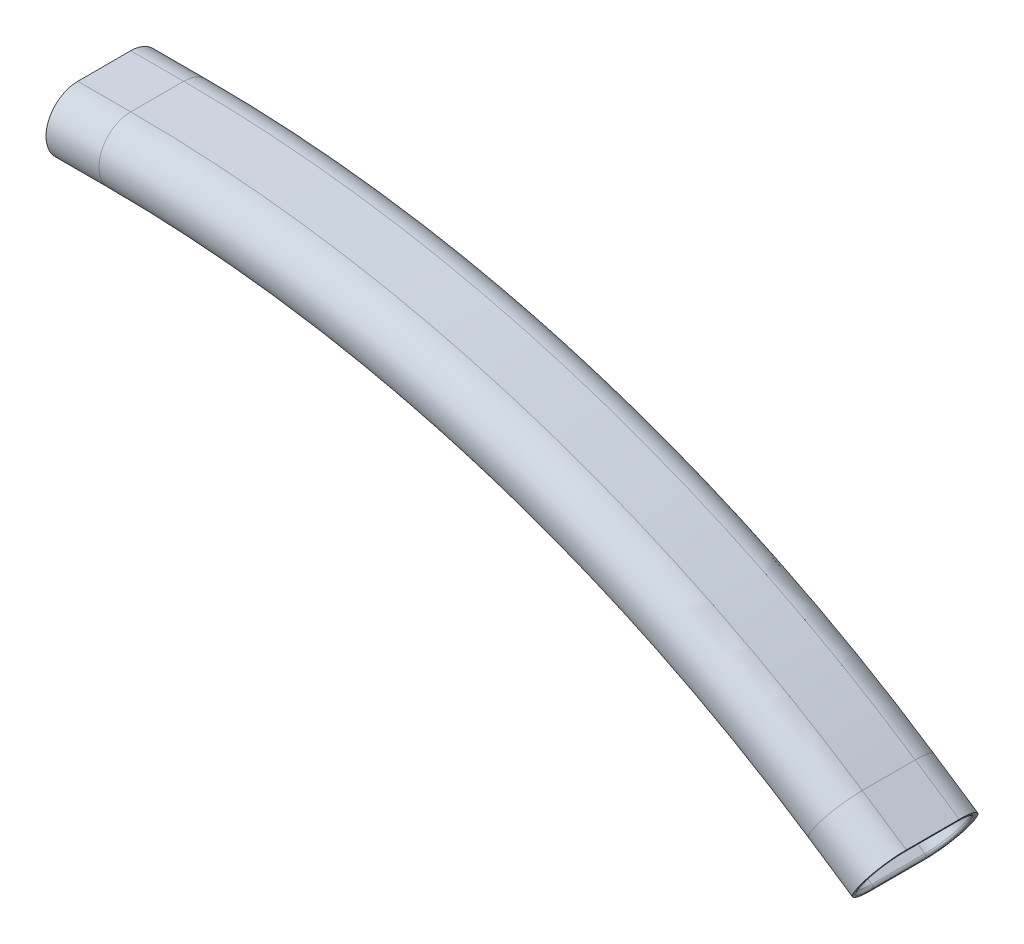
ISO-10303-21;
HEADER;
FILE_DESCRIPTION(('STEP AP214'),'2;1');
FILE_NAME('part.step','',(''),(''),'','','');
FILE_SCHEMA(('AUTOMOTIVE_DESIGN { 1 0 10303 214 1 1 1 1 }'));
ENDSEC;
DATA;
#1=APPLICATION_CONTEXT('core data for automotive mechanical design processes');
#2=APPLICATION_PROTOCOL_DEFINITION('international standard','automotive_design',2000,#1);
#3=PRODUCT_CONTEXT('',#1,'mechanical');
#4=PRODUCT('Part','Part','',(#3));
#5=PRODUCT_RELATED_PRODUCT_CATEGORY('part','',(#4));
#6=PRODUCT_DEFINITION_FORMATION('','',#4);
#7=PRODUCT_DEFINITION_CONTEXT('part definition',#1,'design');
#8=PRODUCT_DEFINITION('design','',#6,#7);
#9=PRODUCT_DEFINITION_SHAPE('','',#8);
#10=(LENGTH_UNIT() NAMED_UNIT(*) SI_UNIT(.MILLI.,.METRE.));
#11=(NAMED_UNIT(*) PLANE_ANGLE_UNIT() SI_UNIT($,.RADIAN.));
#12=(NAMED_UNIT(*) SI_UNIT($,.STERADIAN.) SOLID_ANGLE_UNIT());
#13=UNCERTAINTY_MEASURE_WITH_UNIT(LENGTH_MEASURE(1.E-05),#10,'distance_accuracy_value','');
#14=(GEOMETRIC_REPRESENTATION_CONTEXT(3) GLOBAL_UNCERTAINTY_ASSIGNED_CONTEXT((#13)) GLOBAL_UNIT_ASSIGNED_CONTEXT((#10,
#11,#12)) REPRESENTATION_CONTEXT('',''));
#15=CARTESIAN_POINT('',(0.,0.,0.));
#16=DIRECTION('',(0.,0.,1.));
#17=DIRECTION('',(1.,0.,0.));
#18=AXIS2_PLACEMENT_3D('',#15,#16,#17);
#19=CARTESIAN_POINT('',(141.46233619601,54.1213362956667,5.));
#20=DIRECTION('',(-0.555570233019603,-0.831469612302545,0.));
#21=DIRECTION('',(0.831469612302545,-0.555570233019603,0.));
#22=AXIS2_PLACEMENT_3D('',#19,#20,#21);
#23=PLANE('',#22);
#24=DIRECTION('',(0.,0.,-1.));
#25=VECTOR('',#24,1.);
#26=CARTESIAN_POINT('',(141.46233619601,54.1213362956667,5.));
#27=LINE('',#26,#25);
#28=CARTESIAN_POINT('',(141.46233619601,54.1213362956667,5.));
#29=VERTEX_POINT('',#28);
#30=CARTESIAN_POINT('',(141.46233619601,54.1213362956667,-5.));
#31=VERTEX_POINT('',#30);
#32=EDGE_CURVE('E271',#29,#31,#27,.T.);
#33=ORIENTED_EDGE('',*,*,#32,.T.);
#34=DIRECTION('',(0.831469612302545,-0.555570233019603,0.));
#35=VECTOR('',#34,1.);
#36=CARTESIAN_POINT('',(141.46233619601,54.1213362956667,-5.));
#37=LINE('',#36,#35);
#38=CARTESIAN_POINT('',(149.777032319036,48.5656339654706,-5.));
#39=VERTEX_POINT('',#38);
#40=EDGE_CURVE('E318',#31,#39,#37,.T.);
#41=ORIENTED_EDGE('',*,*,#40,.T.);
#42=DIRECTION('',(0.,0.,-1.));
#43=VECTOR('',#42,1.);
#44=CARTESIAN_POINT('',(149.777032319036,48.5656339654706,5.));
#45=LINE('',#44,#43);
#46=CARTESIAN_POINT('',(149.777032319036,48.5656339654706,5.));
#47=VERTEX_POINT('',#46);
#48=EDGE_CURVE('E302',#47,#39,#45,.T.);
#49=ORIENTED_EDGE('',*,*,#48,.F.);
#50=DIRECTION('',(0.831469612302545,-0.555570233019603,0.));
#51=VECTOR('',#50,1.);
#52=CARTESIAN_POINT('',(141.46233619601,54.1213362956667,5.));
#53=LINE('',#52,#51);
#54=EDGE_CURVE('E321',#29,#47,#53,.T.);
#55=ORIENTED_EDGE('',*,*,#54,.F.);
#56=EDGE_LOOP('',(#33,#41,#49,#55));
#57=FACE_BOUND('',#56,.T.);
#58=ADVANCED_FACE('F32',(#57),#23,.T.);
#59=CARTESIAN_POINT('',(144.795757594128,59.1101539694819,-5.));
#60=DIRECTION('',(0.831469612302545,-0.555570233019603,0.));
#61=DIRECTION('',(0.555570233019603,0.831469612302545,0.));
#62=AXIS2_PLACEMENT_3D('',#59,#60,#61);
#63=CYLINDRICAL_SURFACE('',#62,6.00000000000001);
#64=CARTESIAN_POINT('',(144.795757594128,59.1101539694819,-5.));
#65=DIRECTION('',(0.831469612302544,-0.555570233019603,0.));
#66=DIRECTION('',(0.,0.,-1.));
#67=AXIS2_PLACEMENT_3D('',#64,#65,#66);
#68=CIRCLE('',#67,6.00000000000001);
#69=CARTESIAN_POINT('',(148.129178992246,64.0989716432972,-5.));
#70=VERTEX_POINT('',#69);
#71=EDGE_CURVE('E268',#31,#70,#68,.T.);
#72=ORIENTED_EDGE('',*,*,#71,.T.);
#73=DIRECTION('',(0.831469612302545,-0.555570233019603,0.));
#74=VECTOR('',#73,1.);
#75=CARTESIAN_POINT('',(148.129178992246,64.0989716432972,-5.));
#76=LINE('',#75,#74);
#77=CARTESIAN_POINT('',(156.443875115271,58.5432693131012,-5.));
#78=VERTEX_POINT('',#77);
#79=EDGE_CURVE('E315',#70,#78,#76,.T.);
#80=ORIENTED_EDGE('',*,*,#79,.T.);
#81=CARTESIAN_POINT('',(153.110453717153,53.5544516392859,-5.));
#82=DIRECTION('',(0.831469612302544,-0.555570233019603,0.));
#83=DIRECTION('',(0.,0.,-1.));
#84=AXIS2_PLACEMENT_3D('',#81,#82,#83);
#85=CIRCLE('',#84,6.00000000000001);
#86=EDGE_CURVE('E299',#39,#78,#85,.T.);
#87=ORIENTED_EDGE('',*,*,#86,.F.);
#88=ORIENTED_EDGE('',*,*,#40,.F.);
#89=EDGE_LOOP('',(#72,#80,#87,#88));
#90=FACE_BOUND('',#89,.T.);
#91=ADVANCED_FACE('F437',(#90),#63,.T.);
#92=CARTESIAN_POINT('',(148.129178992246,64.0989716432972,5.));
#93=DIRECTION('',(0.555570233019603,0.831469612302545,0.));
#94=DIRECTION('',(-0.831469612302545,0.555570233019603,0.));
#95=AXIS2_PLACEMENT_3D('',#92,#93,#94);
#96=PLANE('',#95);
#97=DIRECTION('',(0.,0.,1.));
#98=VECTOR('',#97,1.);
#99=CARTESIAN_POINT('',(148.129178992246,64.0989716432972,5.));
#100=LINE('',#99,#98);
#101=CARTESIAN_POINT('',(148.129178992246,64.0989716432972,5.));
#102=VERTEX_POINT('',#101);
#103=EDGE_CURVE('E265',#70,#102,#100,.T.);
#104=ORIENTED_EDGE('',*,*,#103,.T.);
#105=DIRECTION('',(0.831469612302545,-0.555570233019603,0.));
#106=VECTOR('',#105,1.);
#107=CARTESIAN_POINT('',(148.129178992246,64.0989716432972,5.));
#108=LINE('',#107,#106);
#109=CARTESIAN_POINT('',(156.443875115271,58.5432693131012,5.));
#110=VERTEX_POINT('',#109);
#111=EDGE_CURVE('E305',#102,#110,#108,.T.);
#112=ORIENTED_EDGE('',*,*,#111,.T.);
#113=DIRECTION('',(0.,0.,1.));
#114=VECTOR('',#113,1.);
#115=CARTESIAN_POINT('',(156.443875115271,58.5432693131012,5.));
#116=LINE('',#115,#114);
#117=EDGE_CURVE('E295',#78,#110,#116,.T.);
#118=ORIENTED_EDGE('',*,*,#117,.F.);
#119=ORIENTED_EDGE('',*,*,#79,.F.);
#120=EDGE_LOOP('',(#104,#112,#118,#119));
#121=FACE_BOUND('',#120,.T.);
#122=ADVANCED_FACE('F443',(#121),#96,.T.);
#123=CARTESIAN_POINT('',(144.795757594128,59.1101539694819,5.));
#124=DIRECTION('',(0.831469612302545,-0.555570233019603,0.));
#125=DIRECTION('',(0.555570233019603,0.831469612302545,0.));
#126=AXIS2_PLACEMENT_3D('',#123,#124,#125);
#127=CYLINDRICAL_SURFACE('',#126,6.);
#128=CARTESIAN_POINT('',(144.795757594128,59.1101539694819,5.));
#129=DIRECTION('',(0.831469612302544,-0.555570233019603,0.));
#130=DIRECTION('',(0.,0.,-1.));
#131=AXIS2_PLACEMENT_3D('',#128,#129,#130);
#132=CIRCLE('',#131,6.);
#133=EDGE_CURVE('E182',#102,#29,#132,.T.);
#134=ORIENTED_EDGE('',*,*,#133,.T.);
#135=ORIENTED_EDGE('',*,*,#54,.T.);
#136=CARTESIAN_POINT('',(153.110453717153,53.5544516392859,5.));
#137=DIRECTION('',(0.831469612302544,-0.555570233019603,0.));
#138=DIRECTION('',(0.,0.,-1.));
#139=AXIS2_PLACEMENT_3D('',#136,#137,#138);
#140=CIRCLE('',#139,6.);
#141=EDGE_CURVE('E292',#110,#47,#140,.T.);
#142=ORIENTED_EDGE('',*,*,#141,.F.);
#143=ORIENTED_EDGE('',*,*,#111,.F.);
#144=EDGE_LOOP('',(#134,#135,#142,#143));
#145=FACE_BOUND('',#144,.T.);
#146=ADVANCED_FACE('F673',(#145),#127,.T.);
#147=CARTESIAN_POINT('',(147.573608759226,63.2675020309947,5.));
#148=DIRECTION('',(0.555570233019603,0.831469612302545,0.));
#149=DIRECTION('',(-0.831469612302545,0.555570233019603,0.));
#150=AXIS2_PLACEMENT_3D('',#147,#148,#149);
#151=PLANE('',#150);
#152=DIRECTION('',(0.831469612302545,-0.555570233019603,0.));
#153=VECTOR('',#152,1.);
#154=CARTESIAN_POINT('',(147.573608759226,63.2675020309947,-5.));
#155=LINE('',#154,#153);
#156=CARTESIAN_POINT('',(147.573608759226,63.2675020309947,-5.));
#157=VERTEX_POINT('',#156);
#158=CARTESIAN_POINT('',(155.4725700761,57.9895848173085,-5.));
#159=VERTEX_POINT('',#158);
#160=EDGE_CURVE('E309',#157,#159,#155,.T.);
#161=ORIENTED_EDGE('',*,*,#160,.T.);
#162=DIRECTION('',(0.,0.,1.));
#163=VECTOR('',#162,1.);
#164=CARTESIAN_POINT('',(155.4725700761,57.9895848173085,5.));
#165=LINE('',#164,#163);
#166=CARTESIAN_POINT('',(155.4725700761,57.9895848173085,5.));
#167=VERTEX_POINT('',#166);
#168=EDGE_CURVE('E350',#159,#167,#165,.T.);
#169=ORIENTED_EDGE('',*,*,#168,.T.);
#170=DIRECTION('',(0.831469612302545,-0.555570233019603,0.));
#171=VECTOR('',#170,1.);
#172=CARTESIAN_POINT('',(147.573608759226,63.2675020309947,5.));
#173=LINE('',#172,#171);
#174=CARTESIAN_POINT('',(147.573608759226,63.2675020309947,5.));
#175=VERTEX_POINT('',#174);
#176=EDGE_CURVE('E296',#175,#167,#173,.T.);
#177=ORIENTED_EDGE('',*,*,#176,.F.);
#178=DIRECTION('',(0.,0.,1.));
#179=VECTOR('',#178,1.);
#180=CARTESIAN_POINT('',(147.573608759226,63.2675020309947,5.));
#181=LINE('',#180,#179);
#182=EDGE_CURVE('E179',#157,#175,#181,.T.);
#183=ORIENTED_EDGE('',*,*,#182,.F.);
#184=EDGE_LOOP('',(#161,#169,#177,#183));
#185=FACE_BOUND('',#184,.T.);
#186=ADVANCED_FACE('F666',(#185),#151,.F.);
#187=CARTESIAN_POINT('',(144.795757594128,59.1101539694819,-5.));
#188=DIRECTION('',(0.831469612302545,-0.555570233019603,0.));
#189=DIRECTION('',(0.555570233019603,0.831469612302545,0.));
#190=AXIS2_PLACEMENT_3D('',#187,#188,#189);
#191=CYLINDRICAL_SURFACE('',#190,5.00000000000002);
#192=DIRECTION('',(0.831469612302545,-0.555570233019603,0.));
#193=VECTOR('',#192,1.);
#194=CARTESIAN_POINT('',(142.01790642903,54.9528059079692,-5.));
#195=LINE('',#194,#193);
#196=CARTESIAN_POINT('',(142.01790642903,54.9528059079692,-5.));
#197=VERTEX_POINT('',#196);
#198=CARTESIAN_POINT('',(149.916867745904,49.674888694283,-5.));
#199=VERTEX_POINT('',#198);
#200=EDGE_CURVE('E307',#197,#199,#195,.T.);
#201=ORIENTED_EDGE('',*,*,#200,.T.);
#202=CARTESIAN_POINT('',(152.694718911002,53.8322367557957,-5.));
#203=DIRECTION('',(0.831469612302544,-0.555570233019603,0.));
#204=DIRECTION('',(0.555570233019603,0.831469612302544,0.));
#205=AXIS2_PLACEMENT_3D('',#202,#203,#204);
#206=CIRCLE('',#205,5.00000000000002);
#207=EDGE_CURVE('E54',#199,#159,#206,.T.);
#208=ORIENTED_EDGE('',*,*,#207,.T.);
#209=ORIENTED_EDGE('',*,*,#160,.F.);
#210=CARTESIAN_POINT('',(144.795757594128,59.1101539694819,-5.));
#211=DIRECTION('',(0.831469612302544,-0.555570233019603,0.));
#212=DIRECTION('',(0.,0.,-1.));
#213=AXIS2_PLACEMENT_3D('',#210,#211,#212);
#214=CIRCLE('',#213,5.00000000000002);
#215=EDGE_CURVE('E259',#197,#157,#214,.T.);
#216=ORIENTED_EDGE('',*,*,#215,.F.);
#217=EDGE_LOOP('',(#201,#208,#209,#216));
#218=FACE_BOUND('',#217,.T.);
#219=ADVANCED_FACE('F658',(#218),#191,.F.);
#220=CARTESIAN_POINT('',(142.01790642903,54.9528059079692,5.));
#221=DIRECTION('',(-0.555570233019603,-0.831469612302545,0.));
#222=DIRECTION('',(0.831469612302545,-0.555570233019603,0.));
#223=AXIS2_PLACEMENT_3D('',#220,#221,#222);
#224=PLANE('',#223);
#225=DIRECTION('',(0.831469612302545,-0.555570233019603,0.));
#226=VECTOR('',#225,1.);
#227=CARTESIAN_POINT('',(142.01790642903,54.9528059079692,5.));
#228=LINE('',#227,#226);
#229=CARTESIAN_POINT('',(142.01790642903,54.9528059079692,5.));
#230=VERTEX_POINT('',#229);
#231=CARTESIAN_POINT('',(149.916867745904,49.674888694283,5.));
#232=VERTEX_POINT('',#231);
#233=EDGE_CURVE('E291',#230,#232,#228,.T.);
#234=ORIENTED_EDGE('',*,*,#233,.T.);
#235=DIRECTION('',(0.,0.,-1.));
#236=VECTOR('',#235,1.);
#237=CARTESIAN_POINT('',(149.916867745904,49.674888694283,-5.));
#238=LINE('',#237,#236);
#239=EDGE_CURVE('E11',#232,#199,#238,.T.);
#240=ORIENTED_EDGE('',*,*,#239,.T.);
#241=ORIENTED_EDGE('',*,*,#200,.F.);
#242=DIRECTION('',(0.,0.,-1.));
#243=VECTOR('',#242,1.);
#244=CARTESIAN_POINT('',(142.01790642903,54.9528059079692,5.));
#245=LINE('',#244,#243);
#246=EDGE_CURVE('E256',#230,#197,#245,.T.);
#247=ORIENTED_EDGE('',*,*,#246,.F.);
#248=EDGE_LOOP('',(#234,#240,#241,#247));
#249=FACE_BOUND('',#248,.T.);
#250=ADVANCED_FACE('F393',(#249),#224,.F.);
#251=CARTESIAN_POINT('',(144.795757594128,59.1101539694819,5.));
#252=DIRECTION('',(0.831469612302545,-0.555570233019603,0.));
#253=DIRECTION('',(0.555570233019603,0.831469612302545,0.));
#254=AXIS2_PLACEMENT_3D('',#251,#252,#253);
#255=CYLINDRICAL_SURFACE('',#254,5.00000000000002);
#256=ORIENTED_EDGE('',*,*,#176,.T.);
#257=CARTESIAN_POINT('',(152.694718911002,53.8322367557957,5.));
#258=DIRECTION('',(0.831469612302544,-0.555570233019603,0.));
#259=DIRECTION('',(0.555570233019603,0.831469612302544,0.));
#260=AXIS2_PLACEMENT_3D('',#257,#258,#259);
#261=CIRCLE('',#260,5.00000000000002);
#262=EDGE_CURVE('E338',#167,#232,#261,.T.);
#263=ORIENTED_EDGE('',*,*,#262,.T.);
#264=ORIENTED_EDGE('',*,*,#233,.F.);
#265=CARTESIAN_POINT('',(144.795757594128,59.1101539694819,5.));
#266=DIRECTION('',(0.831469612302544,-0.555570233019603,0.));
#267=DIRECTION('',(0.,0.,-1.));
#268=AXIS2_PLACEMENT_3D('',#265,#266,#267);
#269=CIRCLE('',#268,5.00000000000002);
#270=EDGE_CURVE('E249',#175,#230,#269,.T.);
#271=ORIENTED_EDGE('',*,*,#270,.F.);
#272=EDGE_LOOP('',(#256,#263,#264,#271));
#273=FACE_BOUND('',#272,.T.);
#274=ADVANCED_FACE('F390',(#273),#255,.F.);
#275=CARTESIAN_POINT('',(10.,-142.62595362875,0.));
#276=DIRECTION('',(0.,0.,-1.));
#277=DIRECTION('',(-1.,0.,0.));
#278=AXIS2_PLACEMENT_3D('',#275,#276,#277);
#279=CYLINDRICAL_SURFACE('',#278,236.62595362875);
#280=DIRECTION('',(0.,0.,-1.));
#281=VECTOR('',#280,1.);
#282=CARTESIAN_POINT('',(10.,94.,5.));
#283=LINE('',#282,#281);
#284=CARTESIAN_POINT('',(10.,94.,5.));
#285=VERTEX_POINT('',#284);
#286=CARTESIAN_POINT('',(10.,94.,-5.));
#287=VERTEX_POINT('',#286);
#288=EDGE_CURVE('E219',#285,#287,#283,.T.);
#289=ORIENTED_EDGE('',*,*,#288,.T.);
#290=CARTESIAN_POINT('',(10.,-142.62595362875,-5.));
#291=DIRECTION('',(0.,0.,-1.));
#292=DIRECTION('',(-1.,0.,0.));
#293=AXIS2_PLACEMENT_3D('',#290,#291,#292);
#294=CIRCLE('',#293,236.62595362875);
#295=EDGE_CURVE('E285',#287,#31,#294,.T.);
#296=ORIENTED_EDGE('',*,*,#295,.T.);
#297=ORIENTED_EDGE('',*,*,#32,.F.);
#298=CARTESIAN_POINT('',(10.,-142.62595362875,5.));
#299=DIRECTION('',(0.,0.,-1.));
#300=DIRECTION('',(-1.,0.,0.));
#301=AXIS2_PLACEMENT_3D('',#298,#299,#300);
#302=CIRCLE('',#301,236.62595362875);
#303=EDGE_CURVE('E288',#285,#29,#302,.T.);
#304=ORIENTED_EDGE('',*,*,#303,.F.);
#305=EDGE_LOOP('',(#289,#296,#297,#304));
#306=FACE_BOUND('',#305,.T.);
#307=ADVANCED_FACE('F633',(#306),#279,.F.);
#308=CARTESIAN_POINT('',(10.,-142.62595362875,-5.));
#309=DIRECTION('',(0.,0.,-1.));
#310=DIRECTION('',(-1.,0.,0.));
#311=AXIS2_PLACEMENT_3D('',#308,#309,#310);
#312=TOROIDAL_SURFACE('',#311,242.62595362875,6.00000000000001);
#313=CARTESIAN_POINT('',(10.,100.,-5.));
#314=DIRECTION('',(1.,0.,0.));
#315=DIRECTION('',(0.,0.,-1.));
#316=AXIS2_PLACEMENT_3D('',#313,#314,#315);
#317=CIRCLE('',#316,6.00000000000001);
#318=CARTESIAN_POINT('',(10.,106.,-5.));
#319=VERTEX_POINT('',#318);
#320=EDGE_CURVE('E222',#287,#319,#317,.T.);
#321=ORIENTED_EDGE('',*,*,#320,.T.);
#322=CARTESIAN_POINT('',(10.,-142.62595362875,-5.));
#323=DIRECTION('',(0.,0.,-1.));
#324=DIRECTION('',(-1.,0.,0.));
#325=AXIS2_PLACEMENT_3D('',#322,#323,#324);
#326=CIRCLE('',#325,248.62595362875);
#327=EDGE_CURVE('E282',#319,#70,#326,.T.);
#328=ORIENTED_EDGE('',*,*,#327,.T.);
#329=ORIENTED_EDGE('',*,*,#71,.F.);
#330=ORIENTED_EDGE('',*,*,#295,.F.);
#331=EDGE_LOOP('',(#321,#328,#329,#330));
#332=FACE_BOUND('',#331,.T.);
#333=ADVANCED_FACE('F624',(#332),#312,.T.);
#334=CARTESIAN_POINT('',(10.,-142.62595362875,0.));
#335=DIRECTION('',(0.,0.,-1.));
#336=DIRECTION('',(-1.,0.,0.));
#337=AXIS2_PLACEMENT_3D('',#334,#335,#336);
#338=CYLINDRICAL_SURFACE('',#337,248.62595362875);
#339=DIRECTION('',(0.,0.,1.));
#340=VECTOR('',#339,1.);
#341=CARTESIAN_POINT('',(10.,106.,5.));
#342=LINE('',#341,#340);
#343=CARTESIAN_POINT('',(10.,106.,5.));
#344=VERTEX_POINT('',#343);
#345=EDGE_CURVE('E225',#319,#344,#342,.T.);
#346=ORIENTED_EDGE('',*,*,#345,.T.);
#347=CARTESIAN_POINT('',(10.,-142.62595362875,5.));
#348=DIRECTION('',(0.,0.,-1.));
#349=DIRECTION('',(-1.,0.,0.));
#350=AXIS2_PLACEMENT_3D('',#347,#348,#349);
#351=CIRCLE('',#350,248.62595362875);
#352=EDGE_CURVE('E274',#344,#102,#351,.T.);
#353=ORIENTED_EDGE('',*,*,#352,.T.);
#354=ORIENTED_EDGE('',*,*,#103,.F.);
#355=ORIENTED_EDGE('',*,*,#327,.F.);
#356=EDGE_LOOP('',(#346,#353,#354,#355));
#357=FACE_BOUND('',#356,.T.);
#358=ADVANCED_FACE('F615',(#357),#338,.T.);
#359=CARTESIAN_POINT('',(10.,-142.62595362875,5.));
#360=DIRECTION('',(0.,0.,-1.));
#361=DIRECTION('',(-1.,0.,0.));
#362=AXIS2_PLACEMENT_3D('',#359,#360,#361);
#363=TOROIDAL_SURFACE('',#362,242.62595362875,6.);
#364=CARTESIAN_POINT('',(10.,100.,5.));
#365=DIRECTION('',(1.,0.,0.));
#366=DIRECTION('',(0.,0.,-1.));
#367=AXIS2_PLACEMENT_3D('',#364,#365,#366);
#368=CIRCLE('',#367,6.);
#369=EDGE_CURVE('E216',#344,#285,#368,.T.);
#370=ORIENTED_EDGE('',*,*,#369,.T.);
#371=ORIENTED_EDGE('',*,*,#303,.T.);
#372=ORIENTED_EDGE('',*,*,#133,.F.);
#373=ORIENTED_EDGE('',*,*,#352,.F.);
#374=EDGE_LOOP('',(#370,#371,#372,#373));
#375=FACE_BOUND('',#374,.T.);
#376=ADVANCED_FACE('F607',(#375),#363,.T.);
#377=CARTESIAN_POINT('',(10.,-142.62595362875,0.));
#378=DIRECTION('',(0.,0.,-1.));
#379=DIRECTION('',(-1.,0.,0.));
#380=AXIS2_PLACEMENT_3D('',#377,#378,#379);
#381=CYLINDRICAL_SURFACE('',#380,247.62595362875);
#382=DIRECTION('',(0.,0.,1.));
#383=VECTOR('',#382,1.);
#384=CARTESIAN_POINT('',(10.,105.,5.));
#385=LINE('',#384,#383);
#386=CARTESIAN_POINT('',(10.,105.,-5.));
#387=VERTEX_POINT('',#386);
#388=CARTESIAN_POINT('',(10.,105.,5.));
#389=VERTEX_POINT('',#388);
#390=EDGE_CURVE('E176',#387,#389,#385,.T.);
#391=ORIENTED_EDGE('',*,*,#390,.F.);
#392=CARTESIAN_POINT('',(10.,-142.62595362875,-5.));
#393=DIRECTION('',(0.,0.,-1.));
#394=DIRECTION('',(-1.,0.,0.));
#395=AXIS2_PLACEMENT_3D('',#392,#393,#394);
#396=CIRCLE('',#395,247.62595362875);
#397=EDGE_CURVE('E183',#387,#157,#396,.T.);
#398=ORIENTED_EDGE('',*,*,#397,.T.);
#399=ORIENTED_EDGE('',*,*,#182,.T.);
#400=CARTESIAN_POINT('',(10.,-142.62595362875,5.));
#401=DIRECTION('',(0.,0.,-1.));
#402=DIRECTION('',(-1.,0.,0.));
#403=AXIS2_PLACEMENT_3D('',#400,#401,#402);
#404=CIRCLE('',#403,247.62595362875);
#405=EDGE_CURVE('E171',#389,#175,#404,.T.);
#406=ORIENTED_EDGE('',*,*,#405,.F.);
#407=EDGE_LOOP('',(#391,#398,#399,#406));
#408=FACE_BOUND('',#407,.T.);
#409=ADVANCED_FACE('F173',(#408),#381,.F.);
#410=CARTESIAN_POINT('',(10.,-142.62595362875,-5.));
#411=DIRECTION('',(0.,0.,-1.));
#412=DIRECTION('',(-1.,0.,0.));
#413=AXIS2_PLACEMENT_3D('',#410,#411,#412);
#414=TOROIDAL_SURFACE('',#413,242.62595362875,5.00000000000002);
#415=CARTESIAN_POINT('',(10.,100.,-5.));
#416=DIRECTION('',(1.,0.,0.));
#417=DIRECTION('',(0.,0.,-1.));
#418=AXIS2_PLACEMENT_3D('',#415,#416,#417);
#419=CIRCLE('',#418,5.00000000000002);
#420=CARTESIAN_POINT('',(10.,95.,-5.));
#421=VERTEX_POINT('',#420);
#422=EDGE_CURVE('E209',#421,#387,#419,.T.);
#423=ORIENTED_EDGE('',*,*,#422,.F.);
#424=CARTESIAN_POINT('',(10.,-142.62595362875,-5.));
#425=DIRECTION('',(0.,0.,-1.));
#426=DIRECTION('',(-1.,0.,0.));
#427=AXIS2_PLACEMENT_3D('',#424,#425,#426);
#428=CIRCLE('',#427,237.62595362875);
#429=EDGE_CURVE('E276',#421,#197,#428,.T.);
#430=ORIENTED_EDGE('',*,*,#429,.T.);
#431=ORIENTED_EDGE('',*,*,#215,.T.);
#432=ORIENTED_EDGE('',*,*,#397,.F.);
#433=EDGE_LOOP('',(#423,#430,#431,#432));
#434=FACE_BOUND('',#433,.T.);
#435=ADVANCED_FACE('F591',(#434),#414,.F.);
#436=CARTESIAN_POINT('',(10.,-142.62595362875,0.));
#437=DIRECTION('',(0.,0.,-1.));
#438=DIRECTION('',(-1.,0.,0.));
#439=AXIS2_PLACEMENT_3D('',#436,#437,#438);
#440=CYLINDRICAL_SURFACE('',#439,237.62595362875);
#441=DIRECTION('',(0.,0.,-1.));
#442=VECTOR('',#441,1.);
#443=CARTESIAN_POINT('',(10.,95.,5.));
#444=LINE('',#443,#442);
#445=CARTESIAN_POINT('',(10.,95.,5.));
#446=VERTEX_POINT('',#445);
#447=EDGE_CURVE('E211',#446,#421,#444,.T.);
#448=ORIENTED_EDGE('',*,*,#447,.F.);
#449=CARTESIAN_POINT('',(10.,-142.62595362875,5.));
#450=DIRECTION('',(0.,0.,-1.));
#451=DIRECTION('',(-1.,0.,0.));
#452=AXIS2_PLACEMENT_3D('',#449,#450,#451);
#453=CIRCLE('',#452,237.62595362875);
#454=EDGE_CURVE('E190',#446,#230,#453,.T.);
#455=ORIENTED_EDGE('',*,*,#454,.T.);
#456=ORIENTED_EDGE('',*,*,#246,.T.);
#457=ORIENTED_EDGE('',*,*,#429,.F.);
#458=EDGE_LOOP('',(#448,#455,#456,#457));
#459=FACE_BOUND('',#458,.T.);
#460=ADVANCED_FACE('F396',(#459),#440,.T.);
#461=CARTESIAN_POINT('',(10.,-142.62595362875,5.));
#462=DIRECTION('',(0.,0.,-1.));
#463=DIRECTION('',(-1.,0.,0.));
#464=AXIS2_PLACEMENT_3D('',#461,#462,#463);
#465=TOROIDAL_SURFACE('',#464,242.62595362875,5.00000000000002);
#466=CARTESIAN_POINT('',(10.,100.,5.));
#467=DIRECTION('',(1.,0.,0.));
#468=DIRECTION('',(0.,0.,-1.));
#469=AXIS2_PLACEMENT_3D('',#466,#467,#468);
#470=CIRCLE('',#469,5.00000000000002);
#471=EDGE_CURVE('E186',#389,#446,#470,.T.);
#472=ORIENTED_EDGE('',*,*,#471,.F.);
#473=ORIENTED_EDGE('',*,*,#405,.T.);
#474=ORIENTED_EDGE('',*,*,#270,.T.);
#475=ORIENTED_EDGE('',*,*,#454,.F.);
#476=EDGE_LOOP('',(#472,#473,#474,#475));
#477=FACE_BOUND('',#476,.T.);
#478=ADVANCED_FACE('F188',(#477),#465,.F.);
#479=CARTESIAN_POINT('',(10.,100.,5.));
#480=DIRECTION('',(-1.,0.,0.));
#481=DIRECTION('',(0.,0.,1.));
#482=AXIS2_PLACEMENT_3D('',#479,#480,#481);
#483=CYLINDRICAL_SURFACE('',#482,6.);
#484=CARTESIAN_POINT('',(0.,100.,5.));
#485=DIRECTION('',(1.,0.,0.));
#486=DIRECTION('',(0.,0.,-1.));
#487=AXIS2_PLACEMENT_3D('',#484,#485,#486);
#488=CIRCLE('',#487,6.);
#489=CARTESIAN_POINT('',(0.,106.,5.));
#490=VERTEX_POINT('',#489);
#491=CARTESIAN_POINT('',(0.,94.,5.));
#492=VERTEX_POINT('',#491);
#493=EDGE_CURVE('E229',#490,#492,#488,.T.);
#494=ORIENTED_EDGE('',*,*,#493,.T.);
#495=DIRECTION('',(-1.,0.,0.));
#496=VECTOR('',#495,1.);
#497=CARTESIAN_POINT('',(10.,94.,5.));
#498=LINE('',#497,#496);
#499=EDGE_CURVE('E246',#285,#492,#498,.T.);
#500=ORIENTED_EDGE('',*,*,#499,.F.);
#501=ORIENTED_EDGE('',*,*,#369,.F.);
#502=DIRECTION('',(-1.,0.,0.));
#503=VECTOR('',#502,1.);
#504=CARTESIAN_POINT('',(10.,106.,5.));
#505=LINE('',#504,#503);
#506=EDGE_CURVE('E203',#344,#490,#505,.T.);
#507=ORIENTED_EDGE('',*,*,#506,.T.);
#508=EDGE_LOOP('',(#494,#500,#501,#507));
#509=FACE_BOUND('',#508,.T.);
#510=ADVANCED_FACE('F567',(#509),#483,.T.);
#511=CARTESIAN_POINT('',(10.,94.,5.));
#512=DIRECTION('',(0.,1.,0.));
#513=DIRECTION('',(0.,0.,1.));
#514=AXIS2_PLACEMENT_3D('',#511,#512,#513);
#515=PLANE('',#514);
#516=DIRECTION('',(0.,0.,-1.));
#517=VECTOR('',#516,1.);
#518=CARTESIAN_POINT('',(0.,94.,5.));
#519=LINE('',#518,#517);
#520=CARTESIAN_POINT('',(0.,94.,-5.));
#521=VERTEX_POINT('',#520);
#522=EDGE_CURVE('E232',#492,#521,#519,.T.);
#523=ORIENTED_EDGE('',*,*,#522,.T.);
#524=DIRECTION('',(-1.,0.,0.));
#525=VECTOR('',#524,1.);
#526=CARTESIAN_POINT('',(10.,94.,-5.));
#527=LINE('',#526,#525);
#528=EDGE_CURVE('E243',#287,#521,#527,.T.);
#529=ORIENTED_EDGE('',*,*,#528,.F.);
#530=ORIENTED_EDGE('',*,*,#288,.F.);
#531=ORIENTED_EDGE('',*,*,#499,.T.);
#532=EDGE_LOOP('',(#523,#529,#530,#531));
#533=FACE_BOUND('',#532,.T.);
#534=ADVANCED_FACE('F558',(#533),#515,.F.);
#535=CARTESIAN_POINT('',(10.,100.,-5.));
#536=DIRECTION('',(-1.,0.,0.));
#537=DIRECTION('',(0.,0.,1.));
#538=AXIS2_PLACEMENT_3D('',#535,#536,#537);
#539=CYLINDRICAL_SURFACE('',#538,6.00000000000001);
#540=CARTESIAN_POINT('',(0.,100.,-5.));
#541=DIRECTION('',(1.,0.,0.));
#542=DIRECTION('',(0.,0.,-1.));
#543=AXIS2_PLACEMENT_3D('',#540,#541,#542);
#544=CIRCLE('',#543,6.00000000000001);
#545=CARTESIAN_POINT('',(0.,106.,-5.));
#546=VERTEX_POINT('',#545);
#547=EDGE_CURVE('E235',#521,#546,#544,.T.);
#548=ORIENTED_EDGE('',*,*,#547,.T.);
#549=DIRECTION('',(-1.,0.,0.));
#550=VECTOR('',#549,1.);
#551=CARTESIAN_POINT('',(10.,106.,-5.));
#552=LINE('',#551,#550);
#553=EDGE_CURVE('E240',#319,#546,#552,.T.);
#554=ORIENTED_EDGE('',*,*,#553,.F.);
#555=ORIENTED_EDGE('',*,*,#320,.F.);
#556=ORIENTED_EDGE('',*,*,#528,.T.);
#557=EDGE_LOOP('',(#548,#554,#555,#556));
#558=FACE_BOUND('',#557,.T.);
#559=ADVANCED_FACE('F551',(#558),#539,.T.);
#560=CARTESIAN_POINT('',(10.,100.,5.));
#561=DIRECTION('',(-1.,0.,0.));
#562=DIRECTION('',(0.,0.,1.));
#563=AXIS2_PLACEMENT_3D('',#560,#561,#562);
#564=CYLINDRICAL_SURFACE('',#563,5.00000000000002);
#565=DIRECTION('',(-1.,0.,0.));
#566=VECTOR('',#565,1.);
#567=CARTESIAN_POINT('',(10.,95.,5.));
#568=LINE('',#567,#566);
#569=CARTESIAN_POINT('',(0.5,95.,5.));
#570=VERTEX_POINT('',#569);
#571=EDGE_CURVE('E228',#446,#570,#568,.T.);
#572=ORIENTED_EDGE('',*,*,#571,.T.);
#573=CARTESIAN_POINT('',(0.5,100.,5.));
#574=DIRECTION('',(1.,0.,0.));
#575=DIRECTION('',(0.,0.,-1.));
#576=AXIS2_PLACEMENT_3D('',#573,#574,#575);
#577=CIRCLE('',#576,5.00000000000002);
#578=CARTESIAN_POINT('',(0.5,105.,5.));
#579=VERTEX_POINT('',#578);
#580=EDGE_CURVE('E201',#570,#579,#577,.F.);
#581=ORIENTED_EDGE('',*,*,#580,.T.);
#582=DIRECTION('',(-1.,0.,0.));
#583=VECTOR('',#582,1.);
#584=CARTESIAN_POINT('',(10.,105.,5.));
#585=LINE('',#584,#583);
#586=EDGE_CURVE('E198',#389,#579,#585,.T.);
#587=ORIENTED_EDGE('',*,*,#586,.F.);
#588=ORIENTED_EDGE('',*,*,#471,.T.);
#589=EDGE_LOOP('',(#572,#581,#587,#588));
#590=FACE_BOUND('',#589,.T.);
#591=ADVANCED_FACE('F199',(#590),#564,.F.);
#592=CARTESIAN_POINT('',(10.,105.,5.));
#593=DIRECTION('',(0.,-1.,0.));
#594=DIRECTION('',(0.,0.,-1.));
#595=AXIS2_PLACEMENT_3D('',#592,#593,#594);
#596=PLANE('',#595);
#597=ORIENTED_EDGE('',*,*,#586,.T.);
#598=DIRECTION('',(0.,0.,1.));
#599=VECTOR('',#598,1.);
#600=CARTESIAN_POINT('',(0.5,105.,-5.));
#601=LINE('',#600,#599);
#602=CARTESIAN_POINT('',(0.5,105.,-5.));
#603=VERTEX_POINT('',#602);
#604=EDGE_CURVE('E334',#579,#603,#601,.F.);
#605=ORIENTED_EDGE('',*,*,#604,.T.);
#606=DIRECTION('',(-1.,0.,0.));
#607=VECTOR('',#606,1.);
#608=CARTESIAN_POINT('',(10.,105.,-5.));
#609=LINE('',#608,#607);
#610=EDGE_CURVE('E204',#387,#603,#609,.T.);
#611=ORIENTED_EDGE('',*,*,#610,.F.);
#612=ORIENTED_EDGE('',*,*,#390,.T.);
#613=EDGE_LOOP('',(#597,#605,#611,#612));
#614=FACE_BOUND('',#613,.T.);
#615=ADVANCED_FACE('F206',(#614),#596,.T.);
#616=CARTESIAN_POINT('',(10.,100.,-5.));
#617=DIRECTION('',(-1.,0.,0.));
#618=DIRECTION('',(0.,0.,1.));
#619=AXIS2_PLACEMENT_3D('',#616,#617,#618);
#620=CYLINDRICAL_SURFACE('',#619,5.00000000000002);
#621=ORIENTED_EDGE('',*,*,#610,.T.);
#622=CARTESIAN_POINT('',(0.5,100.,-5.));
#623=DIRECTION('',(1.,0.,0.));
#624=DIRECTION('',(0.,0.,-1.));
#625=AXIS2_PLACEMENT_3D('',#622,#623,#624);
#626=CIRCLE('',#625,5.00000000000002);
#627=CARTESIAN_POINT('',(0.5,95.,-5.));
#628=VERTEX_POINT('',#627);
#629=EDGE_CURVE('E336',#603,#628,#626,.F.);
#630=ORIENTED_EDGE('',*,*,#629,.T.);
#631=DIRECTION('',(-1.,0.,0.));
#632=VECTOR('',#631,1.);
#633=CARTESIAN_POINT('',(10.,95.,-5.));
#634=LINE('',#633,#632);
#635=EDGE_CURVE('E251',#421,#628,#634,.T.);
#636=ORIENTED_EDGE('',*,*,#635,.F.);
#637=ORIENTED_EDGE('',*,*,#422,.T.);
#638=EDGE_LOOP('',(#621,#630,#636,#637));
#639=FACE_BOUND('',#638,.T.);
#640=ADVANCED_FACE('F422',(#639),#620,.F.);
#641=CARTESIAN_POINT('',(10.,95.,5.));
#642=DIRECTION('',(0.,1.,0.));
#643=DIRECTION('',(0.,0.,1.));
#644=AXIS2_PLACEMENT_3D('',#641,#642,#643);
#645=PLANE('',#644);
#646=ORIENTED_EDGE('',*,*,#635,.T.);
#647=DIRECTION('',(0.,0.,-1.));
#648=VECTOR('',#647,1.);
#649=CARTESIAN_POINT('',(0.5,95.,5.));
#650=LINE('',#649,#648);
#651=EDGE_CURVE('E41',#628,#570,#650,.F.);
#652=ORIENTED_EDGE('',*,*,#651,.T.);
#653=ORIENTED_EDGE('',*,*,#571,.F.);
#654=ORIENTED_EDGE('',*,*,#447,.T.);
#655=EDGE_LOOP('',(#646,#652,#653,#654));
#656=FACE_BOUND('',#655,.T.);
#657=ADVANCED_FACE('F400',(#656),#645,.T.);
#658=CARTESIAN_POINT('',(10.,106.,5.));
#659=DIRECTION('',(0.,-1.,0.));
#660=DIRECTION('',(0.,0.,-1.));
#661=AXIS2_PLACEMENT_3D('',#658,#659,#660);
#662=PLANE('',#661);
#663=DIRECTION('',(0.,0.,1.));
#664=VECTOR('',#663,1.);
#665=CARTESIAN_POINT('',(0.,106.,5.));
#666=LINE('',#665,#664);
#667=EDGE_CURVE('E194',#546,#490,#666,.T.);
#668=ORIENTED_EDGE('',*,*,#667,.T.);
#669=ORIENTED_EDGE('',*,*,#506,.F.);
#670=ORIENTED_EDGE('',*,*,#345,.F.);
#671=ORIENTED_EDGE('',*,*,#553,.T.);
#672=EDGE_LOOP('',(#668,#669,#670,#671));
#673=FACE_BOUND('',#672,.T.);
#674=ADVANCED_FACE('F512',(#673),#662,.F.);
#675=CARTESIAN_POINT('',(153.110453717153,53.5544516392859,5.));
#676=DIRECTION('',(0.831469612302544,-0.555570233019603,0.));
#677=DIRECTION('',(0.,0.,-1.));
#678=AXIS2_PLACEMENT_3D('',#675,#676,#677);
#679=PLANE('',#678);
#680=DIRECTION('',(0.,0.,-1.));
#681=VECTOR('',#680,1.);
#682=CARTESIAN_POINT('',(150.054817435546,48.9813687716219,5.));
#683=LINE('',#682,#681);
#684=CARTESIAN_POINT('',(150.054817435546,48.9813687716219,-5.));
#685=VERTEX_POINT('',#684);
#686=CARTESIAN_POINT('',(150.054817435546,48.9813687716219,5.));
#687=VERTEX_POINT('',#686);
#688=EDGE_CURVE('E341',#685,#687,#683,.F.);
#689=ORIENTED_EDGE('',*,*,#688,.T.);
#690=CARTESIAN_POINT('',(153.110453717153,53.5544516392859,5.));
#691=DIRECTION('',(0.831469612302544,-0.555570233019603,0.));
#692=DIRECTION('',(0.555570233019603,0.831469612302544,0.));
#693=AXIS2_PLACEMENT_3D('',#690,#691,#692);
#694=CIRCLE('',#693,5.50000000000002);
#695=CARTESIAN_POINT('',(156.166089998761,58.1275345069499,5.));
#696=VERTEX_POINT('',#695);
#697=EDGE_CURVE('E347',#687,#696,#694,.F.);
#698=ORIENTED_EDGE('',*,*,#697,.T.);
#699=DIRECTION('',(0.,0.,1.));
#700=VECTOR('',#699,1.);
#701=CARTESIAN_POINT('',(156.166089998761,58.1275345069499,-5.));
#702=LINE('',#701,#700);
#703=CARTESIAN_POINT('',(156.166089998761,58.1275345069499,-5.));
#704=VERTEX_POINT('',#703);
#705=EDGE_CURVE('E345',#696,#704,#702,.F.);
#706=ORIENTED_EDGE('',*,*,#705,.T.);
#707=CARTESIAN_POINT('',(153.110453717153,53.5544516392859,-5.));
#708=DIRECTION('',(0.831469612302544,-0.555570233019603,0.));
#709=DIRECTION('',(0.555570233019603,0.831469612302544,0.));
#710=AXIS2_PLACEMENT_3D('',#707,#708,#709);
#711=CIRCLE('',#710,5.50000000000002);
#712=EDGE_CURVE('E343',#704,#685,#711,.F.);
#713=ORIENTED_EDGE('',*,*,#712,.T.);
#714=EDGE_LOOP('',(#689,#698,#706,#713));
#715=FACE_BOUND('',#714,.T.);
#716=ORIENTED_EDGE('',*,*,#141,.T.);
#717=ORIENTED_EDGE('',*,*,#48,.T.);
#718=ORIENTED_EDGE('',*,*,#86,.T.);
#719=ORIENTED_EDGE('',*,*,#117,.T.);
#720=EDGE_LOOP('',(#716,#717,#718,#719));
#721=FACE_BOUND('',#720,.T.);
#722=ADVANCED_FACE('F381',(#715,#721),#679,.T.);
#723=CARTESIAN_POINT('',(0.,100.,5.));
#724=DIRECTION('',(1.,0.,0.));
#725=DIRECTION('',(0.,0.,-1.));
#726=AXIS2_PLACEMENT_3D('',#723,#724,#725);
#727=PLANE('',#726);
#728=DIRECTION('',(0.,0.,1.));
#729=VECTOR('',#728,1.);
#730=CARTESIAN_POINT('',(0.,105.5,5.));
#731=LINE('',#730,#729);
#732=CARTESIAN_POINT('',(0.,105.5,-5.));
#733=VERTEX_POINT('',#732);
#734=CARTESIAN_POINT('',(0.,105.5,5.));
#735=VERTEX_POINT('',#734);
#736=EDGE_CURVE('E328',#733,#735,#731,.T.);
#737=ORIENTED_EDGE('',*,*,#736,.T.);
#738=CARTESIAN_POINT('',(0.,100.,5.));
#739=DIRECTION('',(1.,0.,0.));
#740=DIRECTION('',(0.,0.,-1.));
#741=AXIS2_PLACEMENT_3D('',#738,#739,#740);
#742=CIRCLE('',#741,5.50000000000002);
#743=CARTESIAN_POINT('',(0.,94.5,5.));
#744=VERTEX_POINT('',#743);
#745=EDGE_CURVE('E330',#735,#744,#742,.T.);
#746=ORIENTED_EDGE('',*,*,#745,.T.);
#747=DIRECTION('',(0.,0.,-1.));
#748=VECTOR('',#747,1.);
#749=CARTESIAN_POINT('',(0.,94.5,-5.));
#750=LINE('',#749,#748);
#751=CARTESIAN_POINT('',(0.,94.5,-5.));
#752=VERTEX_POINT('',#751);
#753=EDGE_CURVE('E324',#744,#752,#750,.T.);
#754=ORIENTED_EDGE('',*,*,#753,.T.);
#755=CARTESIAN_POINT('',(0.,100.,-5.));
#756=DIRECTION('',(1.,0.,0.));
#757=DIRECTION('',(0.,0.,-1.));
#758=AXIS2_PLACEMENT_3D('',#755,#756,#757);
#759=CIRCLE('',#758,5.50000000000002);
#760=EDGE_CURVE('E326',#752,#733,#759,.T.);
#761=ORIENTED_EDGE('',*,*,#760,.T.);
#762=EDGE_LOOP('',(#737,#746,#754,#761));
#763=FACE_BOUND('',#762,.T.);
#764=ORIENTED_EDGE('',*,*,#493,.F.);
#765=ORIENTED_EDGE('',*,*,#667,.F.);
#766=ORIENTED_EDGE('',*,*,#547,.F.);
#767=ORIENTED_EDGE('',*,*,#522,.F.);
#768=EDGE_LOOP('',(#764,#765,#766,#767));
#769=FACE_BOUND('',#768,.T.);
#770=ADVANCED_FACE('F414',(#763,#769),#727,.F.);
#771=CARTESIAN_POINT('',(0.5,100.,-5.));
#772=DIRECTION('',(1.,0.,0.));
#773=DIRECTION('',(0.,0.,-1.));
#774=AXIS2_PLACEMENT_3D('',#771,#772,#773);
#775=TOROIDAL_SURFACE('',#774,5.50000000000002,0.5);
#776=CARTESIAN_POINT('',(0.5,94.5,-5.));
#777=DIRECTION('',(0.,0.,1.));
#778=DIRECTION('',(1.,0.,0.));
#779=AXIS2_PLACEMENT_3D('',#776,#777,#778);
#780=CIRCLE('',#779,0.5);
#781=EDGE_CURVE('E358',#628,#752,#780,.T.);
#782=ORIENTED_EDGE('',*,*,#781,.F.);
#783=ORIENTED_EDGE('',*,*,#629,.F.);
#784=CARTESIAN_POINT('',(0.5,105.5,-5.));
#785=DIRECTION('',(0.,0.,1.));
#786=DIRECTION('',(1.,0.,0.));
#787=AXIS2_PLACEMENT_3D('',#784,#785,#786);
#788=CIRCLE('',#787,0.5);
#789=EDGE_CURVE('E233',#733,#603,#788,.T.);
#790=ORIENTED_EDGE('',*,*,#789,.F.);
#791=ORIENTED_EDGE('',*,*,#760,.F.);
#792=EDGE_LOOP('',(#782,#783,#790,#791));
#793=FACE_BOUND('',#792,.T.);
#794=ADVANCED_FACE('F425',(#793),#775,.T.);
#795=CARTESIAN_POINT('',(0.5,105.5,5.));
#796=DIRECTION('',(0.,0.,-1.));
#797=DIRECTION('',(-1.,0.,0.));
#798=AXIS2_PLACEMENT_3D('',#795,#796,#797);
#799=CYLINDRICAL_SURFACE('',#798,0.5);
#800=ORIENTED_EDGE('',*,*,#789,.T.);
#801=ORIENTED_EDGE('',*,*,#604,.F.);
#802=CARTESIAN_POINT('',(0.5,105.5,5.));
#803=DIRECTION('',(0.,0.,1.));
#804=DIRECTION('',(1.,0.,0.));
#805=AXIS2_PLACEMENT_3D('',#802,#803,#804);
#806=CIRCLE('',#805,0.5);
#807=EDGE_CURVE('E356',#735,#579,#806,.T.);
#808=ORIENTED_EDGE('',*,*,#807,.F.);
#809=ORIENTED_EDGE('',*,*,#736,.F.);
#810=EDGE_LOOP('',(#800,#801,#808,#809));
#811=FACE_BOUND('',#810,.T.);
#812=ADVANCED_FACE('F419',(#811),#799,.T.);
#813=CARTESIAN_POINT('',(0.5,94.5,5.));
#814=DIRECTION('',(0.,0.,1.));
#815=DIRECTION('',(1.,0.,0.));
#816=AXIS2_PLACEMENT_3D('',#813,#814,#815);
#817=CYLINDRICAL_SURFACE('',#816,0.5);
#818=ORIENTED_EDGE('',*,*,#781,.T.);
#819=ORIENTED_EDGE('',*,*,#753,.F.);
#820=CARTESIAN_POINT('',(0.5,94.5,5.));
#821=DIRECTION('',(0.,0.,1.));
#822=DIRECTION('',(1.,0.,0.));
#823=AXIS2_PLACEMENT_3D('',#820,#821,#822);
#824=CIRCLE('',#823,0.5);
#825=EDGE_CURVE('E354',#570,#744,#824,.T.);
#826=ORIENTED_EDGE('',*,*,#825,.F.);
#827=ORIENTED_EDGE('',*,*,#651,.F.);
#828=EDGE_LOOP('',(#818,#819,#826,#827));
#829=FACE_BOUND('',#828,.T.);
#830=ADVANCED_FACE('F410',(#829),#817,.T.);
#831=CARTESIAN_POINT('',(0.5,100.,5.));
#832=DIRECTION('',(1.,0.,0.));
#833=DIRECTION('',(0.,0.,-1.));
#834=AXIS2_PLACEMENT_3D('',#831,#832,#833);
#835=TOROIDAL_SURFACE('',#834,5.50000000000002,0.5);
#836=ORIENTED_EDGE('',*,*,#807,.T.);
#837=ORIENTED_EDGE('',*,*,#580,.F.);
#838=ORIENTED_EDGE('',*,*,#825,.T.);
#839=ORIENTED_EDGE('',*,*,#745,.F.);
#840=EDGE_LOOP('',(#836,#837,#838,#839));
#841=FACE_BOUND('',#840,.T.);
#842=ADVANCED_FACE('F404',(#841),#835,.T.);
#843=CARTESIAN_POINT('',(152.694718911002,53.8322367557957,-5.));
#844=DIRECTION('',(0.831469612302544,-0.555570233019603,0.));
#845=DIRECTION('',(0.555570233019603,0.831469612302544,0.));
#846=AXIS2_PLACEMENT_3D('',#843,#844,#845);
#847=TOROIDAL_SURFACE('',#846,5.50000000000002,0.5);
#848=CARTESIAN_POINT('',(149.639082629394,49.2591538881317,-5.));
#849=DIRECTION('',(0.,0.,1.));
#850=DIRECTION('',(1.,0.,0.));
#851=AXIS2_PLACEMENT_3D('',#848,#849,#850);
#852=CIRCLE('',#851,0.5);
#853=EDGE_CURVE('E366',#685,#199,#852,.T.);
#854=ORIENTED_EDGE('',*,*,#853,.F.);
#855=ORIENTED_EDGE('',*,*,#712,.F.);
#856=CARTESIAN_POINT('',(155.75035519261,58.4053196234597,-5.));
#857=DIRECTION('',(0.,0.,1.));
#858=DIRECTION('',(1.,0.,0.));
#859=AXIS2_PLACEMENT_3D('',#856,#857,#858);
#860=CIRCLE('',#859,0.5);
#861=EDGE_CURVE('E36',#159,#704,#860,.T.);
#862=ORIENTED_EDGE('',*,*,#861,.F.);
#863=ORIENTED_EDGE('',*,*,#207,.F.);
#864=EDGE_LOOP('',(#854,#855,#862,#863));
#865=FACE_BOUND('',#864,.T.);
#866=ADVANCED_FACE('F34',(#865),#847,.T.);
#867=CARTESIAN_POINT('',(155.75035519261,58.4053196234597,5.));
#868=DIRECTION('',(0.,0.,-1.));
#869=DIRECTION('',(-1.,0.,0.));
#870=AXIS2_PLACEMENT_3D('',#867,#868,#869);
#871=CYLINDRICAL_SURFACE('',#870,0.5);
#872=ORIENTED_EDGE('',*,*,#861,.T.);
#873=ORIENTED_EDGE('',*,*,#705,.F.);
#874=CARTESIAN_POINT('',(155.75035519261,58.4053196234597,5.));
#875=DIRECTION('',(0.,0.,1.));
#876=DIRECTION('',(1.,0.,0.));
#877=AXIS2_PLACEMENT_3D('',#874,#875,#876);
#878=CIRCLE('',#877,0.5);
#879=EDGE_CURVE('E365',#167,#696,#878,.T.);
#880=ORIENTED_EDGE('',*,*,#879,.F.);
#881=ORIENTED_EDGE('',*,*,#168,.F.);
#882=EDGE_LOOP('',(#872,#873,#880,#881));
#883=FACE_BOUND('',#882,.T.);
#884=ADVANCED_FACE('F376',(#883),#871,.T.);
#885=CARTESIAN_POINT('',(149.639082629394,49.2591538881317,5.));
#886=DIRECTION('',(0.,0.,1.));
#887=DIRECTION('',(1.,0.,0.));
#888=AXIS2_PLACEMENT_3D('',#885,#886,#887);
#889=CYLINDRICAL_SURFACE('',#888,0.5);
#890=ORIENTED_EDGE('',*,*,#853,.T.);
#891=ORIENTED_EDGE('',*,*,#239,.F.);
#892=CARTESIAN_POINT('',(149.639082629394,49.2591538881317,5.));
#893=DIRECTION('',(0.,0.,1.));
#894=DIRECTION('',(1.,0.,0.));
#895=AXIS2_PLACEMENT_3D('',#892,#893,#894);
#896=CIRCLE('',#895,0.5);
#897=EDGE_CURVE('E363',#687,#232,#896,.T.);
#898=ORIENTED_EDGE('',*,*,#897,.F.);
#899=ORIENTED_EDGE('',*,*,#688,.F.);
#900=EDGE_LOOP('',(#890,#891,#898,#899));
#901=FACE_BOUND('',#900,.T.);
#902=ADVANCED_FACE('F388',(#901),#889,.T.);
#903=CARTESIAN_POINT('',(152.694718911002,53.8322367557957,5.));
#904=DIRECTION('',(0.831469612302544,-0.555570233019603,0.));
#905=DIRECTION('',(0.555570233019603,0.831469612302544,0.));
#906=AXIS2_PLACEMENT_3D('',#903,#904,#905);
#907=TOROIDAL_SURFACE('',#906,5.50000000000002,0.5);
#908=ORIENTED_EDGE('',*,*,#879,.T.);
#909=ORIENTED_EDGE('',*,*,#697,.F.);
#910=ORIENTED_EDGE('',*,*,#897,.T.);
#911=ORIENTED_EDGE('',*,*,#262,.F.);
#912=EDGE_LOOP('',(#908,#909,#910,#911));
#913=FACE_BOUND('',#912,.T.);
#914=ADVANCED_FACE('F386',(#913),#907,.T.);
#915=CLOSED_SHELL('',(#58,#91,#122,#146,#186,#219,#250,#274,#307,#333,#358,#376,#409,#435,#460,
#478,#510,#534,#559,#591,#615,#640,#657,#674,#722,#770,#794,#812,#830,#842,#866,#884,#902,#914));
#916=MANIFOLD_SOLID_BREP('B2',#915);
#917=ADVANCED_BREP_SHAPE_REPRESENTATION('',(#18,#916),#14);
#918=SHAPE_DEFINITION_REPRESENTATION(#9,#917);
ENDSEC;
END-ISO-10303-21;
